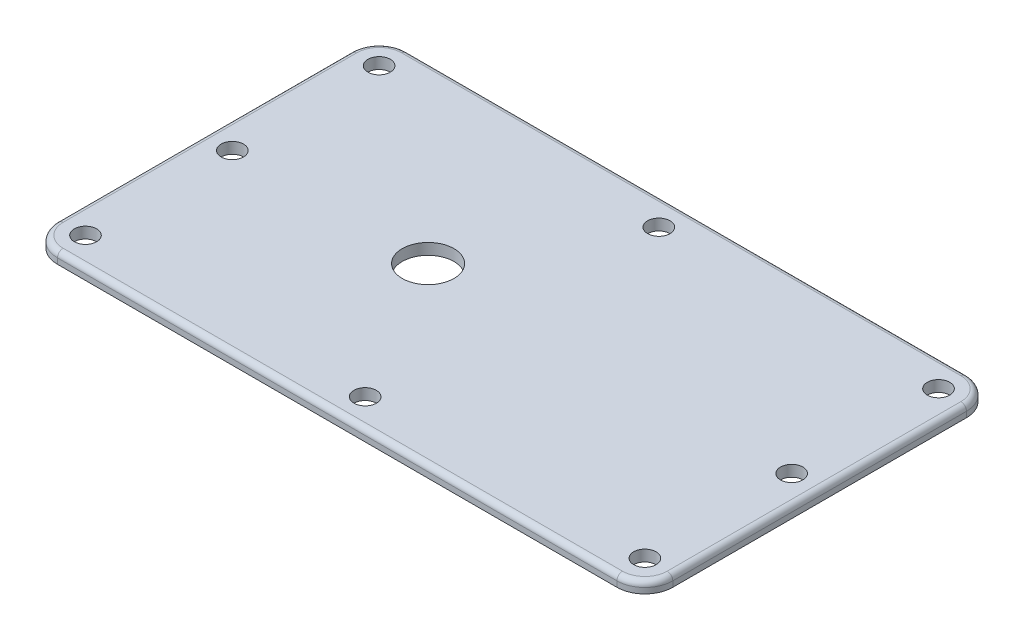
ISO-10303-21;
HEADER;
FILE_DESCRIPTION(('STEP AP214'),'2;1');
FILE_NAME('part.step','',(''),(''),'','','');
FILE_SCHEMA(('AUTOMOTIVE_DESIGN { 1 0 10303 214 1 1 1 1 }'));
ENDSEC;
DATA;
#1=APPLICATION_CONTEXT('core data for automotive mechanical design processes');
#2=APPLICATION_PROTOCOL_DEFINITION('international standard','automotive_design',2000,#1);
#3=PRODUCT_CONTEXT('',#1,'mechanical');
#4=PRODUCT('Part','Part','',(#3));
#5=PRODUCT_RELATED_PRODUCT_CATEGORY('part','',(#4));
#6=PRODUCT_DEFINITION_FORMATION('','',#4);
#7=PRODUCT_DEFINITION_CONTEXT('part definition',#1,'design');
#8=PRODUCT_DEFINITION('design','',#6,#7);
#9=PRODUCT_DEFINITION_SHAPE('','',#8);
#10=(LENGTH_UNIT() NAMED_UNIT(*) SI_UNIT(.MILLI.,.METRE.));
#11=(NAMED_UNIT(*) PLANE_ANGLE_UNIT() SI_UNIT($,.RADIAN.));
#12=(NAMED_UNIT(*) SI_UNIT($,.STERADIAN.) SOLID_ANGLE_UNIT());
#13=UNCERTAINTY_MEASURE_WITH_UNIT(LENGTH_MEASURE(1.E-05),#10,'distance_accuracy_value','');
#14=(GEOMETRIC_REPRESENTATION_CONTEXT(3) GLOBAL_UNCERTAINTY_ASSIGNED_CONTEXT((#13)) GLOBAL_UNIT_ASSIGNED_CONTEXT((#10,
#11,#12)) REPRESENTATION_CONTEXT('',''));
#15=CARTESIAN_POINT('',(0.,0.,0.));
#16=DIRECTION('',(0.,0.,1.));
#17=DIRECTION('',(1.,0.,0.));
#18=AXIS2_PLACEMENT_3D('',#15,#16,#17);
#19=CARTESIAN_POINT('',(109.428571428571,0.,-53.8392857142857));
#20=DIRECTION('',(0.,-1.,0.));
#21=DIRECTION('',(0.,0.,-1.));
#22=AXIS2_PLACEMENT_3D('',#19,#20,#21);
#23=PLANE('',#22);
#24=CARTESIAN_POINT('',(-20.5714285714286,0.,-1.33928571428573));
#25=DIRECTION('',(0.,1.,0.));
#26=DIRECTION('',(0.,0.,1.));
#27=AXIS2_PLACEMENT_3D('',#24,#25,#26);
#28=CIRCLE('',#27,9.25);
#29=CARTESIAN_POINT('',(-20.5714285714286,0.,7.91071428571427));
#30=VERTEX_POINT('',#29);
#31=EDGE_CURVE('E585',#30,#30,#28,.T.);
#32=ORIENTED_EDGE('',*,*,#31,.T.);
#33=EDGE_LOOP('',(#32));
#34=FACE_BOUND('',#33,.T.);
#35=CARTESIAN_POINT('',(-90.5714285714286,0.,-53.8392857142857));
#36=DIRECTION('',(0.,1.,0.));
#37=DIRECTION('',(0.,0.,1.));
#38=AXIS2_PLACEMENT_3D('',#35,#36,#37);
#39=CIRCLE('',#38,4.);
#40=CARTESIAN_POINT('',(-90.5714285714286,0.,-49.8392857142857));
#41=VERTEX_POINT('',#40);
#42=EDGE_CURVE('E581',#41,#41,#39,.T.);
#43=ORIENTED_EDGE('',*,*,#42,.T.);
#44=EDGE_LOOP('',(#43));
#45=FACE_BOUND('',#44,.T.);
#46=CARTESIAN_POINT('',(109.428571428571,0.,-53.8392857142857));
#47=DIRECTION('',(0.,1.,0.));
#48=DIRECTION('',(0.,0.,1.));
#49=AXIS2_PLACEMENT_3D('',#46,#47,#48);
#50=CIRCLE('',#49,4.);
#51=CARTESIAN_POINT('',(109.428571428571,0.,-49.8392857142857));
#52=VERTEX_POINT('',#51);
#53=EDGE_CURVE('E577',#52,#52,#50,.T.);
#54=ORIENTED_EDGE('',*,*,#53,.T.);
#55=EDGE_LOOP('',(#54));
#56=FACE_BOUND('',#55,.T.);
#57=CARTESIAN_POINT('',(-90.5714285714286,0.,51.1607142857143));
#58=DIRECTION('',(0.,1.,0.));
#59=DIRECTION('',(0.,0.,1.));
#60=AXIS2_PLACEMENT_3D('',#57,#58,#59);
#61=CIRCLE('',#60,4.);
#62=CARTESIAN_POINT('',(-90.5714285714286,0.,55.1607142857143));
#63=VERTEX_POINT('',#62);
#64=EDGE_CURVE('E573',#63,#63,#61,.T.);
#65=ORIENTED_EDGE('',*,*,#64,.T.);
#66=EDGE_LOOP('',(#65));
#67=FACE_BOUND('',#66,.T.);
#68=CARTESIAN_POINT('',(109.428571428571,0.,51.1607142857143));
#69=DIRECTION('',(0.,1.,0.));
#70=DIRECTION('',(0.,0.,1.));
#71=AXIS2_PLACEMENT_3D('',#68,#69,#70);
#72=CIRCLE('',#71,4.);
#73=CARTESIAN_POINT('',(109.428571428571,0.,55.1607142857143));
#74=VERTEX_POINT('',#73);
#75=EDGE_CURVE('E569',#74,#74,#72,.T.);
#76=ORIENTED_EDGE('',*,*,#75,.T.);
#77=EDGE_LOOP('',(#76));
#78=FACE_BOUND('',#77,.T.);
#79=CARTESIAN_POINT('',(109.428571428571,0.,-1.33928571428574));
#80=DIRECTION('',(0.,1.,0.));
#81=DIRECTION('',(0.,0.,1.));
#82=AXIS2_PLACEMENT_3D('',#79,#80,#81);
#83=CIRCLE('',#82,4.);
#84=CARTESIAN_POINT('',(109.428571428571,0.,2.66071428571427));
#85=VERTEX_POINT('',#84);
#86=EDGE_CURVE('E565',#85,#85,#83,.T.);
#87=ORIENTED_EDGE('',*,*,#86,.T.);
#88=EDGE_LOOP('',(#87));
#89=FACE_BOUND('',#88,.T.);
#90=CARTESIAN_POINT('',(9.42857142857137,0.,-53.8392857142857));
#91=DIRECTION('',(0.,1.,0.));
#92=DIRECTION('',(0.,0.,1.));
#93=AXIS2_PLACEMENT_3D('',#90,#91,#92);
#94=CIRCLE('',#93,4.);
#95=CARTESIAN_POINT('',(9.42857142857137,0.,-49.8392857142857));
#96=VERTEX_POINT('',#95);
#97=EDGE_CURVE('E561',#96,#96,#94,.T.);
#98=ORIENTED_EDGE('',*,*,#97,.T.);
#99=EDGE_LOOP('',(#98));
#100=FACE_BOUND('',#99,.T.);
#101=CARTESIAN_POINT('',(-90.5714285714286,0.,-1.33928571428572));
#102=DIRECTION('',(0.,1.,0.));
#103=DIRECTION('',(0.,0.,1.));
#104=AXIS2_PLACEMENT_3D('',#101,#102,#103);
#105=CIRCLE('',#104,4.);
#106=CARTESIAN_POINT('',(-90.5714285714286,0.,2.66071428571428));
#107=VERTEX_POINT('',#106);
#108=EDGE_CURVE('E555',#107,#107,#105,.T.);
#109=ORIENTED_EDGE('',*,*,#108,.T.);
#110=EDGE_LOOP('',(#109));
#111=FACE_BOUND('',#110,.T.);
#112=CARTESIAN_POINT('',(109.428571428571,0.,-53.8392857142857));
#113=DIRECTION('',(0.,1.,0.));
#114=DIRECTION('',(0.,0.,-1.));
#115=AXIS2_PLACEMENT_3D('',#112,#113,#114);
#116=CIRCLE('',#115,10.);
#117=CARTESIAN_POINT('',(119.428571428571,0.,-53.8392857142857));
#118=VERTEX_POINT('',#117);
#119=CARTESIAN_POINT('',(109.428571428571,0.,-63.8392857142857));
#120=VERTEX_POINT('',#119);
#121=EDGE_CURVE('E143',#118,#120,#116,.T.);
#122=ORIENTED_EDGE('',*,*,#121,.F.);
#123=DIRECTION('',(0.,0.,-1.));
#124=VECTOR('',#123,1.);
#125=CARTESIAN_POINT('',(119.428571428571,0.,-53.8392857142857));
#126=LINE('',#125,#124);
#127=CARTESIAN_POINT('',(119.428571428571,0.,51.1607142857142));
#128=VERTEX_POINT('',#127);
#129=EDGE_CURVE('E171',#128,#118,#126,.T.);
#130=ORIENTED_EDGE('',*,*,#129,.F.);
#131=CARTESIAN_POINT('',(109.428571428571,0.,51.1607142857143));
#132=DIRECTION('',(0.,1.,0.));
#133=DIRECTION('',(0.,0.,-1.));
#134=AXIS2_PLACEMENT_3D('',#131,#132,#133);
#135=CIRCLE('',#134,10.);
#136=CARTESIAN_POINT('',(109.428571428571,0.,61.1607142857142));
#137=VERTEX_POINT('',#136);
#138=EDGE_CURVE('E168',#137,#128,#135,.T.);
#139=ORIENTED_EDGE('',*,*,#138,.F.);
#140=DIRECTION('',(1.,0.,0.));
#141=VECTOR('',#140,1.);
#142=CARTESIAN_POINT('',(109.428571428571,0.,61.1607142857142));
#143=LINE('',#142,#141);
#144=CARTESIAN_POINT('',(-90.5714285714285,0.,61.1607142857143));
#145=VERTEX_POINT('',#144);
#146=EDGE_CURVE('E165',#145,#137,#143,.T.);
#147=ORIENTED_EDGE('',*,*,#146,.F.);
#148=CARTESIAN_POINT('',(-90.5714285714286,0.,51.1607142857143));
#149=DIRECTION('',(0.,1.,0.));
#150=DIRECTION('',(0.,0.,-1.));
#151=AXIS2_PLACEMENT_3D('',#148,#149,#150);
#152=CIRCLE('',#151,10.);
#153=CARTESIAN_POINT('',(-100.571428571429,0.,51.1607142857142));
#154=VERTEX_POINT('',#153);
#155=EDGE_CURVE('E162',#154,#145,#152,.T.);
#156=ORIENTED_EDGE('',*,*,#155,.F.);
#157=DIRECTION('',(0.,0.,1.));
#158=VECTOR('',#157,1.);
#159=CARTESIAN_POINT('',(-100.571428571429,0.,51.1607142857142));
#160=LINE('',#159,#158);
#161=CARTESIAN_POINT('',(-100.571428571429,0.,-53.8392857142857));
#162=VERTEX_POINT('',#161);
#163=EDGE_CURVE('E159',#162,#154,#160,.T.);
#164=ORIENTED_EDGE('',*,*,#163,.F.);
#165=CARTESIAN_POINT('',(-90.5714285714286,0.,-53.8392857142857));
#166=DIRECTION('',(0.,1.,0.));
#167=DIRECTION('',(0.,0.,1.));
#168=AXIS2_PLACEMENT_3D('',#165,#166,#167);
#169=CIRCLE('',#168,10.);
#170=CARTESIAN_POINT('',(-90.5714285714286,0.,-63.8392857142857));
#171=VERTEX_POINT('',#170);
#172=EDGE_CURVE('E146',#171,#162,#169,.T.);
#173=ORIENTED_EDGE('',*,*,#172,.F.);
#174=DIRECTION('',(-1.,0.,0.));
#175=VECTOR('',#174,1.);
#176=CARTESIAN_POINT('',(-90.5714285714286,0.,-63.8392857142857));
#177=LINE('',#176,#175);
#178=EDGE_CURVE('E129',#120,#171,#177,.T.);
#179=ORIENTED_EDGE('',*,*,#178,.F.);
#180=EDGE_LOOP('',(#122,#130,#139,#147,#156,#164,#173,#179));
#181=FACE_BOUND('',#180,.T.);
#182=CARTESIAN_POINT('',(9.42857142857137,0.,51.1607142857143));
#183=DIRECTION('',(0.,1.,0.));
#184=DIRECTION('',(0.,0.,1.));
#185=AXIS2_PLACEMENT_3D('',#182,#183,#184);
#186=CIRCLE('',#185,4.);
#187=CARTESIAN_POINT('',(9.42857142857137,0.,55.1607142857143));
#188=VERTEX_POINT('',#187);
#189=EDGE_CURVE('E155',#188,#188,#186,.T.);
#190=ORIENTED_EDGE('',*,*,#189,.T.);
#191=EDGE_LOOP('',(#190));
#192=FACE_BOUND('',#191,.T.);
#193=ADVANCED_FACE('F35',(#34,#45,#56,#67,#78,#89,#100,#111,#181,#192),#23,.T.);
#194=CARTESIAN_POINT('',(109.428571428571,4.,-53.8392857142857));
#195=DIRECTION('',(0.,-1.,0.));
#196=DIRECTION('',(0.,0.,-1.));
#197=AXIS2_PLACEMENT_3D('',#194,#195,#196);
#198=CYLINDRICAL_SURFACE('',#197,10.);
#199=DIRECTION('',(0.,-1.,0.));
#200=VECTOR('',#199,1.);
#201=CARTESIAN_POINT('',(109.428571428571,4.,-63.8392857142857));
#202=LINE('',#201,#200);
#203=CARTESIAN_POINT('',(109.428571428571,2.,-63.8392857142857));
#204=VERTEX_POINT('',#203);
#205=EDGE_CURVE('E125',#204,#120,#202,.T.);
#206=ORIENTED_EDGE('',*,*,#205,.F.);
#207=CARTESIAN_POINT('',(109.428571428571,2.,-53.8392857142857));
#208=DIRECTION('',(0.,-1.,0.));
#209=DIRECTION('',(0.,0.,-1.));
#210=AXIS2_PLACEMENT_3D('',#207,#208,#209);
#211=CIRCLE('',#210,10.);
#212=CARTESIAN_POINT('',(119.428571428571,2.,-53.8392857142857));
#213=VERTEX_POINT('',#212);
#214=EDGE_CURVE('E209',#204,#213,#211,.T.);
#215=ORIENTED_EDGE('',*,*,#214,.T.);
#216=DIRECTION('',(0.,-1.,0.));
#217=VECTOR('',#216,1.);
#218=CARTESIAN_POINT('',(119.428571428571,4.,-53.8392857142857));
#219=LINE('',#218,#217);
#220=EDGE_CURVE('E149',#213,#118,#219,.T.);
#221=ORIENTED_EDGE('',*,*,#220,.T.);
#222=ORIENTED_EDGE('',*,*,#121,.T.);
#223=EDGE_LOOP('',(#206,#215,#221,#222));
#224=FACE_BOUND('',#223,.T.);
#225=ADVANCED_FACE('F148',(#224),#198,.T.);
#226=CARTESIAN_POINT('',(-90.5714285714286,4.,-63.8392857142857));
#227=DIRECTION('',(0.,0.,1.));
#228=DIRECTION('',(1.,0.,0.));
#229=AXIS2_PLACEMENT_3D('',#226,#227,#228);
#230=PLANE('',#229);
#231=DIRECTION('',(0.,-1.,0.));
#232=VECTOR('',#231,1.);
#233=CARTESIAN_POINT('',(-90.5714285714286,4.,-63.8392857142857));
#234=LINE('',#233,#232);
#235=CARTESIAN_POINT('',(-90.5714285714286,2.,-63.8392857142857));
#236=VERTEX_POINT('',#235);
#237=EDGE_CURVE('E137',#236,#171,#234,.T.);
#238=ORIENTED_EDGE('',*,*,#237,.F.);
#239=DIRECTION('',(-1.,0.,0.));
#240=VECTOR('',#239,1.);
#241=CARTESIAN_POINT('',(-90.5714285714286,2.,-63.8392857142857));
#242=LINE('',#241,#240);
#243=EDGE_CURVE('E132',#236,#204,#242,.F.);
#244=ORIENTED_EDGE('',*,*,#243,.T.);
#245=ORIENTED_EDGE('',*,*,#205,.T.);
#246=ORIENTED_EDGE('',*,*,#178,.T.);
#247=EDGE_LOOP('',(#238,#244,#245,#246));
#248=FACE_BOUND('',#247,.T.);
#249=ADVANCED_FACE('F128',(#248),#230,.F.);
#250=CARTESIAN_POINT('',(-90.5714285714286,4.,-53.8392857142857));
#251=DIRECTION('',(0.,-1.,0.));
#252=DIRECTION('',(0.,0.,-1.));
#253=AXIS2_PLACEMENT_3D('',#250,#251,#252);
#254=CYLINDRICAL_SURFACE('',#253,10.);
#255=DIRECTION('',(0.,-1.,0.));
#256=VECTOR('',#255,1.);
#257=CARTESIAN_POINT('',(-100.571428571429,4.,-53.8392857142857));
#258=LINE('',#257,#256);
#259=CARTESIAN_POINT('',(-100.571428571429,2.,-53.8392857142857));
#260=VERTEX_POINT('',#259);
#261=EDGE_CURVE('E182',#260,#162,#258,.T.);
#262=ORIENTED_EDGE('',*,*,#261,.F.);
#263=CARTESIAN_POINT('',(-90.5714285714286,2.,-53.8392857142857));
#264=DIRECTION('',(0.,-1.,0.));
#265=DIRECTION('',(0.,0.,-1.));
#266=AXIS2_PLACEMENT_3D('',#263,#264,#265);
#267=CIRCLE('',#266,10.);
#268=EDGE_CURVE('E206',#260,#236,#267,.T.);
#269=ORIENTED_EDGE('',*,*,#268,.T.);
#270=ORIENTED_EDGE('',*,*,#237,.T.);
#271=ORIENTED_EDGE('',*,*,#172,.T.);
#272=EDGE_LOOP('',(#262,#269,#270,#271));
#273=FACE_BOUND('',#272,.T.);
#274=ADVANCED_FACE('F273',(#273),#254,.T.);
#275=CARTESIAN_POINT('',(-100.571428571429,4.,51.1607142857142));
#276=DIRECTION('',(1.,0.,0.));
#277=DIRECTION('',(0.,0.,-1.));
#278=AXIS2_PLACEMENT_3D('',#275,#276,#277);
#279=PLANE('',#278);
#280=DIRECTION('',(0.,-1.,0.));
#281=VECTOR('',#280,1.);
#282=CARTESIAN_POINT('',(-100.571428571429,4.,51.1607142857142));
#283=LINE('',#282,#281);
#284=CARTESIAN_POINT('',(-100.571428571429,2.,51.1607142857142));
#285=VERTEX_POINT('',#284);
#286=EDGE_CURVE('E180',#285,#154,#283,.T.);
#287=ORIENTED_EDGE('',*,*,#286,.F.);
#288=DIRECTION('',(0.,0.,1.));
#289=VECTOR('',#288,1.);
#290=CARTESIAN_POINT('',(-100.571428571429,2.,51.1607142857142));
#291=LINE('',#290,#289);
#292=EDGE_CURVE('E204',#285,#260,#291,.F.);
#293=ORIENTED_EDGE('',*,*,#292,.T.);
#294=ORIENTED_EDGE('',*,*,#261,.T.);
#295=ORIENTED_EDGE('',*,*,#163,.T.);
#296=EDGE_LOOP('',(#287,#293,#294,#295));
#297=FACE_BOUND('',#296,.T.);
#298=ADVANCED_FACE('F270',(#297),#279,.F.);
#299=CARTESIAN_POINT('',(-90.5714285714286,4.,51.1607142857143));
#300=DIRECTION('',(0.,-1.,0.));
#301=DIRECTION('',(0.,0.,-1.));
#302=AXIS2_PLACEMENT_3D('',#299,#300,#301);
#303=CYLINDRICAL_SURFACE('',#302,10.);
#304=DIRECTION('',(0.,-1.,0.));
#305=VECTOR('',#304,1.);
#306=CARTESIAN_POINT('',(-90.5714285714285,4.,61.1607142857143));
#307=LINE('',#306,#305);
#308=CARTESIAN_POINT('',(-90.5714285714285,2.,61.1607142857143));
#309=VERTEX_POINT('',#308);
#310=EDGE_CURVE('E178',#309,#145,#307,.T.);
#311=ORIENTED_EDGE('',*,*,#310,.F.);
#312=CARTESIAN_POINT('',(-90.5714285714286,2.,51.1607142857143));
#313=DIRECTION('',(0.,-1.,0.));
#314=DIRECTION('',(0.,0.,-1.));
#315=AXIS2_PLACEMENT_3D('',#312,#313,#314);
#316=CIRCLE('',#315,10.);
#317=EDGE_CURVE('E201',#309,#285,#316,.T.);
#318=ORIENTED_EDGE('',*,*,#317,.T.);
#319=ORIENTED_EDGE('',*,*,#286,.T.);
#320=ORIENTED_EDGE('',*,*,#155,.T.);
#321=EDGE_LOOP('',(#311,#318,#319,#320));
#322=FACE_BOUND('',#321,.T.);
#323=ADVANCED_FACE('F255',(#322),#303,.T.);
#324=CARTESIAN_POINT('',(109.428571428571,4.,61.1607142857142));
#325=DIRECTION('',(0.,0.,-1.));
#326=DIRECTION('',(-1.,0.,0.));
#327=AXIS2_PLACEMENT_3D('',#324,#325,#326);
#328=PLANE('',#327);
#329=DIRECTION('',(0.,-1.,0.));
#330=VECTOR('',#329,1.);
#331=CARTESIAN_POINT('',(109.428571428571,4.,61.1607142857142));
#332=LINE('',#331,#330);
#333=CARTESIAN_POINT('',(109.428571428571,2.,61.1607142857142));
#334=VERTEX_POINT('',#333);
#335=EDGE_CURVE('E176',#334,#137,#332,.T.);
#336=ORIENTED_EDGE('',*,*,#335,.F.);
#337=DIRECTION('',(1.,0.,0.));
#338=VECTOR('',#337,1.);
#339=CARTESIAN_POINT('',(109.428571428571,2.,61.1607142857142));
#340=LINE('',#339,#338);
#341=EDGE_CURVE('E11',#334,#309,#340,.F.);
#342=ORIENTED_EDGE('',*,*,#341,.T.);
#343=ORIENTED_EDGE('',*,*,#310,.T.);
#344=ORIENTED_EDGE('',*,*,#146,.T.);
#345=EDGE_LOOP('',(#336,#342,#343,#344));
#346=FACE_BOUND('',#345,.T.);
#347=ADVANCED_FACE('F252',(#346),#328,.F.);
#348=CARTESIAN_POINT('',(109.428571428571,4.,51.1607142857143));
#349=DIRECTION('',(0.,-1.,0.));
#350=DIRECTION('',(0.,0.,-1.));
#351=AXIS2_PLACEMENT_3D('',#348,#349,#350);
#352=CYLINDRICAL_SURFACE('',#351,10.);
#353=DIRECTION('',(0.,-1.,0.));
#354=VECTOR('',#353,1.);
#355=CARTESIAN_POINT('',(119.428571428571,4.,51.1607142857142));
#356=LINE('',#355,#354);
#357=CARTESIAN_POINT('',(119.428571428571,2.,51.1607142857142));
#358=VERTEX_POINT('',#357);
#359=EDGE_CURVE('E174',#358,#128,#356,.T.);
#360=ORIENTED_EDGE('',*,*,#359,.F.);
#361=CARTESIAN_POINT('',(109.428571428571,2.,51.1607142857143));
#362=DIRECTION('',(0.,-1.,0.));
#363=DIRECTION('',(0.,0.,-1.));
#364=AXIS2_PLACEMENT_3D('',#361,#362,#363);
#365=CIRCLE('',#364,10.);
#366=EDGE_CURVE('E44',#358,#334,#365,.T.);
#367=ORIENTED_EDGE('',*,*,#366,.T.);
#368=ORIENTED_EDGE('',*,*,#335,.T.);
#369=ORIENTED_EDGE('',*,*,#138,.T.);
#370=EDGE_LOOP('',(#360,#367,#368,#369));
#371=FACE_BOUND('',#370,.T.);
#372=ADVANCED_FACE('F300',(#371),#352,.T.);
#373=CARTESIAN_POINT('',(119.428571428571,4.,-53.8392857142857));
#374=DIRECTION('',(-1.,0.,0.));
#375=DIRECTION('',(0.,0.,1.));
#376=AXIS2_PLACEMENT_3D('',#373,#374,#375);
#377=PLANE('',#376);
#378=ORIENTED_EDGE('',*,*,#220,.F.);
#379=DIRECTION('',(0.,0.,-1.));
#380=VECTOR('',#379,1.);
#381=CARTESIAN_POINT('',(119.428571428571,2.,-53.8392857142857));
#382=LINE('',#381,#380);
#383=EDGE_CURVE('E59',#213,#358,#382,.F.);
#384=ORIENTED_EDGE('',*,*,#383,.T.);
#385=ORIENTED_EDGE('',*,*,#359,.T.);
#386=ORIENTED_EDGE('',*,*,#129,.T.);
#387=EDGE_LOOP('',(#378,#384,#385,#386));
#388=FACE_BOUND('',#387,.T.);
#389=ADVANCED_FACE('F297',(#388),#377,.F.);
#390=CARTESIAN_POINT('',(109.428571428571,4.,-53.8392857142857));
#391=DIRECTION('',(0.,-1.,0.));
#392=DIRECTION('',(0.,0.,-1.));
#393=AXIS2_PLACEMENT_3D('',#390,#391,#392);
#394=PLANE('',#393);
#395=CARTESIAN_POINT('',(-20.5714285714286,4.,-1.33928571428573));
#396=DIRECTION('',(0.,1.,0.));
#397=DIRECTION('',(0.,0.,1.));
#398=AXIS2_PLACEMENT_3D('',#395,#396,#397);
#399=CIRCLE('',#398,9.25);
#400=CARTESIAN_POINT('',(-20.5714285714286,4.,7.91071428571427));
#401=VERTEX_POINT('',#400);
#402=EDGE_CURVE('E522',#401,#401,#399,.T.);
#403=ORIENTED_EDGE('',*,*,#402,.F.);
#404=EDGE_LOOP('',(#403));
#405=FACE_BOUND('',#404,.T.);
#406=CARTESIAN_POINT('',(-90.5714285714286,4.,-53.8392857142857));
#407=DIRECTION('',(0.,1.,0.));
#408=DIRECTION('',(0.,0.,1.));
#409=AXIS2_PLACEMENT_3D('',#406,#407,#408);
#410=CIRCLE('',#409,4.);
#411=CARTESIAN_POINT('',(-90.5714285714286,4.,-49.8392857142857));
#412=VERTEX_POINT('',#411);
#413=EDGE_CURVE('E526',#412,#412,#410,.T.);
#414=ORIENTED_EDGE('',*,*,#413,.F.);
#415=EDGE_LOOP('',(#414));
#416=FACE_BOUND('',#415,.T.);
#417=CARTESIAN_POINT('',(109.428571428571,4.,-53.8392857142857));
#418=DIRECTION('',(0.,1.,0.));
#419=DIRECTION('',(0.,0.,1.));
#420=AXIS2_PLACEMENT_3D('',#417,#418,#419);
#421=CIRCLE('',#420,4.);
#422=CARTESIAN_POINT('',(109.428571428571,4.,-49.8392857142857));
#423=VERTEX_POINT('',#422);
#424=EDGE_CURVE('E530',#423,#423,#421,.T.);
#425=ORIENTED_EDGE('',*,*,#424,.F.);
#426=EDGE_LOOP('',(#425));
#427=FACE_BOUND('',#426,.T.);
#428=CARTESIAN_POINT('',(-90.5714285714286,4.,51.1607142857143));
#429=DIRECTION('',(0.,1.,0.));
#430=DIRECTION('',(0.,0.,1.));
#431=AXIS2_PLACEMENT_3D('',#428,#429,#430);
#432=CIRCLE('',#431,4.);
#433=CARTESIAN_POINT('',(-90.5714285714286,4.,55.1607142857143));
#434=VERTEX_POINT('',#433);
#435=EDGE_CURVE('E534',#434,#434,#432,.T.);
#436=ORIENTED_EDGE('',*,*,#435,.F.);
#437=EDGE_LOOP('',(#436));
#438=FACE_BOUND('',#437,.T.);
#439=CARTESIAN_POINT('',(109.428571428571,4.,51.1607142857143));
#440=DIRECTION('',(0.,1.,0.));
#441=DIRECTION('',(0.,0.,1.));
#442=AXIS2_PLACEMENT_3D('',#439,#440,#441);
#443=CIRCLE('',#442,4.);
#444=CARTESIAN_POINT('',(109.428571428571,4.,55.1607142857143));
#445=VERTEX_POINT('',#444);
#446=EDGE_CURVE('E538',#445,#445,#443,.T.);
#447=ORIENTED_EDGE('',*,*,#446,.F.);
#448=EDGE_LOOP('',(#447));
#449=FACE_BOUND('',#448,.T.);
#450=CARTESIAN_POINT('',(109.428571428571,4.,-1.33928571428574));
#451=DIRECTION('',(0.,1.,0.));
#452=DIRECTION('',(0.,0.,1.));
#453=AXIS2_PLACEMENT_3D('',#450,#451,#452);
#454=CIRCLE('',#453,4.);
#455=CARTESIAN_POINT('',(109.428571428571,4.,2.66071428571427));
#456=VERTEX_POINT('',#455);
#457=EDGE_CURVE('E542',#456,#456,#454,.T.);
#458=ORIENTED_EDGE('',*,*,#457,.F.);
#459=EDGE_LOOP('',(#458));
#460=FACE_BOUND('',#459,.T.);
#461=CARTESIAN_POINT('',(9.42857142857137,4.,-53.8392857142857));
#462=DIRECTION('',(0.,1.,0.));
#463=DIRECTION('',(0.,0.,1.));
#464=AXIS2_PLACEMENT_3D('',#461,#462,#463);
#465=CIRCLE('',#464,4.);
#466=CARTESIAN_POINT('',(9.42857142857137,4.,-49.8392857142857));
#467=VERTEX_POINT('',#466);
#468=EDGE_CURVE('E546',#467,#467,#465,.T.);
#469=ORIENTED_EDGE('',*,*,#468,.F.);
#470=EDGE_LOOP('',(#469));
#471=FACE_BOUND('',#470,.T.);
#472=CARTESIAN_POINT('',(-90.5714285714286,4.,-1.33928571428572));
#473=DIRECTION('',(0.,1.,0.));
#474=DIRECTION('',(0.,0.,1.));
#475=AXIS2_PLACEMENT_3D('',#472,#473,#474);
#476=CIRCLE('',#475,4.);
#477=CARTESIAN_POINT('',(-90.5714285714286,4.,2.66071428571428));
#478=VERTEX_POINT('',#477);
#479=EDGE_CURVE('E550',#478,#478,#476,.T.);
#480=ORIENTED_EDGE('',*,*,#479,.F.);
#481=EDGE_LOOP('',(#480));
#482=FACE_BOUND('',#481,.T.);
#483=CARTESIAN_POINT('',(9.42857142857137,4.,51.1607142857143));
#484=DIRECTION('',(0.,1.,0.));
#485=DIRECTION('',(0.,0.,1.));
#486=AXIS2_PLACEMENT_3D('',#483,#484,#485);
#487=CIRCLE('',#486,4.);
#488=CARTESIAN_POINT('',(9.42857142857137,4.,55.1607142857143));
#489=VERTEX_POINT('',#488);
#490=EDGE_CURVE('E553',#489,#489,#487,.T.);
#491=ORIENTED_EDGE('',*,*,#490,.F.);
#492=EDGE_LOOP('',(#491));
#493=FACE_BOUND('',#492,.T.);
#494=DIRECTION('',(0.,0.,1.));
#495=VECTOR('',#494,1.);
#496=CARTESIAN_POINT('',(-98.5714285714287,4.,-53.8392857142857));
#497=LINE('',#496,#495);
#498=CARTESIAN_POINT('',(-98.5714285714286,4.,-53.8392857142857));
#499=VERTEX_POINT('',#498);
#500=CARTESIAN_POINT('',(-98.5714285714286,4.,51.1607142857142));
#501=VERTEX_POINT('',#500);
#502=EDGE_CURVE('E196',#499,#501,#497,.T.);
#503=ORIENTED_EDGE('',*,*,#502,.T.);
#504=CARTESIAN_POINT('',(-90.5714285714286,4.,51.1607142857143));
#505=DIRECTION('',(0.,-1.,0.));
#506=DIRECTION('',(0.,0.,-1.));
#507=AXIS2_PLACEMENT_3D('',#504,#505,#506);
#508=CIRCLE('',#507,8.);
#509=CARTESIAN_POINT('',(-90.5714285714285,4.,59.1607142857143));
#510=VERTEX_POINT('',#509);
#511=EDGE_CURVE('E198',#501,#510,#508,.F.);
#512=ORIENTED_EDGE('',*,*,#511,.T.);
#513=DIRECTION('',(1.,0.,0.));
#514=VECTOR('',#513,1.);
#515=CARTESIAN_POINT('',(109.428571428571,4.,59.1607142857143));
#516=LINE('',#515,#514);
#517=CARTESIAN_POINT('',(109.428571428571,4.,59.1607142857143));
#518=VERTEX_POINT('',#517);
#519=EDGE_CURVE('E136',#510,#518,#516,.T.);
#520=ORIENTED_EDGE('',*,*,#519,.T.);
#521=CARTESIAN_POINT('',(109.428571428571,4.,51.1607142857143));
#522=DIRECTION('',(0.,-1.,0.));
#523=DIRECTION('',(0.,0.,-1.));
#524=AXIS2_PLACEMENT_3D('',#521,#522,#523);
#525=CIRCLE('',#524,8.);
#526=CARTESIAN_POINT('',(117.428571428571,4.,51.1607142857142));
#527=VERTEX_POINT('',#526);
#528=EDGE_CURVE('E186',#518,#527,#525,.F.);
#529=ORIENTED_EDGE('',*,*,#528,.T.);
#530=DIRECTION('',(0.,0.,-1.));
#531=VECTOR('',#530,1.);
#532=CARTESIAN_POINT('',(117.428571428571,4.,-53.8392857142857));
#533=LINE('',#532,#531);
#534=CARTESIAN_POINT('',(117.428571428571,4.,-53.8392857142857));
#535=VERTEX_POINT('',#534);
#536=EDGE_CURVE('E188',#527,#535,#533,.T.);
#537=ORIENTED_EDGE('',*,*,#536,.T.);
#538=CARTESIAN_POINT('',(109.428571428571,4.,-53.8392857142857));
#539=DIRECTION('',(0.,-1.,0.));
#540=DIRECTION('',(0.,0.,-1.));
#541=AXIS2_PLACEMENT_3D('',#538,#539,#540);
#542=CIRCLE('',#541,8.);
#543=CARTESIAN_POINT('',(109.428571428571,4.,-61.8392857142857));
#544=VERTEX_POINT('',#543);
#545=EDGE_CURVE('E190',#535,#544,#542,.F.);
#546=ORIENTED_EDGE('',*,*,#545,.T.);
#547=DIRECTION('',(-1.,0.,0.));
#548=VECTOR('',#547,1.);
#549=CARTESIAN_POINT('',(109.428571428571,4.,-61.8392857142857));
#550=LINE('',#549,#548);
#551=CARTESIAN_POINT('',(-90.5714285714286,4.,-61.8392857142857));
#552=VERTEX_POINT('',#551);
#553=EDGE_CURVE('E192',#544,#552,#550,.T.);
#554=ORIENTED_EDGE('',*,*,#553,.T.);
#555=CARTESIAN_POINT('',(-90.5714285714286,4.,-53.8392857142857));
#556=DIRECTION('',(0.,-1.,0.));
#557=DIRECTION('',(0.,0.,-1.));
#558=AXIS2_PLACEMENT_3D('',#555,#556,#557);
#559=CIRCLE('',#558,8.00000000000001);
#560=EDGE_CURVE('E194',#552,#499,#559,.F.);
#561=ORIENTED_EDGE('',*,*,#560,.T.);
#562=EDGE_LOOP('',(#503,#512,#520,#529,#537,#546,#554,#561));
#563=FACE_BOUND('',#562,.T.);
#564=ADVANCED_FACE('F239',(#405,#416,#427,#438,#449,#460,#471,#482,#493,#563),#394,.F.);
#565=CARTESIAN_POINT('',(109.428571428571,2.,-53.8392857142857));
#566=DIRECTION('',(0.,-1.,0.));
#567=DIRECTION('',(0.,0.,-1.));
#568=AXIS2_PLACEMENT_3D('',#565,#566,#567);
#569=TOROIDAL_SURFACE('',#568,8.,2.);
#570=CARTESIAN_POINT('',(117.428571428571,2.,-53.8392857142857));
#571=DIRECTION('',(0.,0.,1.));
#572=DIRECTION('',(1.,0.,0.));
#573=AXIS2_PLACEMENT_3D('',#570,#571,#572);
#574=CIRCLE('',#573,2.);
#575=EDGE_CURVE('E153',#213,#535,#574,.T.);
#576=ORIENTED_EDGE('',*,*,#575,.F.);
#577=ORIENTED_EDGE('',*,*,#214,.F.);
#578=CARTESIAN_POINT('',(109.428571428571,2.,-61.8392857142857));
#579=DIRECTION('',(-1.,0.,0.));
#580=DIRECTION('',(0.,0.,1.));
#581=AXIS2_PLACEMENT_3D('',#578,#579,#580);
#582=CIRCLE('',#581,2.);
#583=EDGE_CURVE('E39',#544,#204,#582,.T.);
#584=ORIENTED_EDGE('',*,*,#583,.F.);
#585=ORIENTED_EDGE('',*,*,#545,.F.);
#586=EDGE_LOOP('',(#576,#577,#584,#585));
#587=FACE_BOUND('',#586,.T.);
#588=ADVANCED_FACE('F37',(#587),#569,.T.);
#589=CARTESIAN_POINT('',(109.428571428571,2.,-61.8392857142857));
#590=DIRECTION('',(-1.,0.,0.));
#591=DIRECTION('',(0.,0.,1.));
#592=AXIS2_PLACEMENT_3D('',#589,#590,#591);
#593=CYLINDRICAL_SURFACE('',#592,2.);
#594=ORIENTED_EDGE('',*,*,#583,.T.);
#595=ORIENTED_EDGE('',*,*,#243,.F.);
#596=CARTESIAN_POINT('',(-90.5714285714286,2.,-61.8392857142857));
#597=DIRECTION('',(-1.,0.,0.));
#598=DIRECTION('',(0.,0.,1.));
#599=AXIS2_PLACEMENT_3D('',#596,#597,#598);
#600=CIRCLE('',#599,2.);
#601=EDGE_CURVE('E226',#552,#236,#600,.T.);
#602=ORIENTED_EDGE('',*,*,#601,.F.);
#603=ORIENTED_EDGE('',*,*,#553,.F.);
#604=EDGE_LOOP('',(#594,#595,#602,#603));
#605=FACE_BOUND('',#604,.T.);
#606=ADVANCED_FACE('F278',(#605),#593,.T.);
#607=CARTESIAN_POINT('',(117.428571428571,2.,-53.8392857142857));
#608=DIRECTION('',(0.,0.,-1.));
#609=DIRECTION('',(-1.,0.,0.));
#610=AXIS2_PLACEMENT_3D('',#607,#608,#609);
#611=CYLINDRICAL_SURFACE('',#610,2.);
#612=ORIENTED_EDGE('',*,*,#575,.T.);
#613=ORIENTED_EDGE('',*,*,#536,.F.);
#614=CARTESIAN_POINT('',(117.428571428571,2.,51.1607142857142));
#615=DIRECTION('',(0.,0.,1.));
#616=DIRECTION('',(1.,0.,0.));
#617=AXIS2_PLACEMENT_3D('',#614,#615,#616);
#618=CIRCLE('',#617,2.);
#619=EDGE_CURVE('E223',#358,#527,#618,.T.);
#620=ORIENTED_EDGE('',*,*,#619,.F.);
#621=ORIENTED_EDGE('',*,*,#383,.F.);
#622=EDGE_LOOP('',(#612,#613,#620,#621));
#623=FACE_BOUND('',#622,.T.);
#624=ADVANCED_FACE('F232',(#623),#611,.T.);
#625=CARTESIAN_POINT('',(-90.5714285714286,2.,-53.8392857142857));
#626=DIRECTION('',(0.,-1.,0.));
#627=DIRECTION('',(0.,0.,-1.));
#628=AXIS2_PLACEMENT_3D('',#625,#626,#627);
#629=TOROIDAL_SURFACE('',#628,8.00000000000001,2.);
#630=ORIENTED_EDGE('',*,*,#601,.T.);
#631=ORIENTED_EDGE('',*,*,#268,.F.);
#632=CARTESIAN_POINT('',(-98.5714285714286,2.,-53.8392857142857));
#633=DIRECTION('',(0.,0.,1.));
#634=DIRECTION('',(1.,0.,0.));
#635=AXIS2_PLACEMENT_3D('',#632,#633,#634);
#636=CIRCLE('',#635,2.);
#637=EDGE_CURVE('E220',#499,#260,#636,.T.);
#638=ORIENTED_EDGE('',*,*,#637,.F.);
#639=ORIENTED_EDGE('',*,*,#560,.F.);
#640=EDGE_LOOP('',(#630,#631,#638,#639));
#641=FACE_BOUND('',#640,.T.);
#642=ADVANCED_FACE('F275',(#641),#629,.T.);
#643=CARTESIAN_POINT('',(109.428571428571,2.,51.1607142857143));
#644=DIRECTION('',(0.,-1.,0.));
#645=DIRECTION('',(0.,0.,-1.));
#646=AXIS2_PLACEMENT_3D('',#643,#644,#645);
#647=TOROIDAL_SURFACE('',#646,8.,2.);
#648=ORIENTED_EDGE('',*,*,#619,.T.);
#649=ORIENTED_EDGE('',*,*,#528,.F.);
#650=CARTESIAN_POINT('',(109.428571428571,2.,59.1607142857143));
#651=DIRECTION('',(-1.,0.,0.));
#652=DIRECTION('',(0.,0.,1.));
#653=AXIS2_PLACEMENT_3D('',#650,#651,#652);
#654=CIRCLE('',#653,2.);
#655=EDGE_CURVE('E217',#334,#518,#654,.T.);
#656=ORIENTED_EDGE('',*,*,#655,.F.);
#657=ORIENTED_EDGE('',*,*,#366,.F.);
#658=EDGE_LOOP('',(#648,#649,#656,#657));
#659=FACE_BOUND('',#658,.T.);
#660=ADVANCED_FACE('F245',(#659),#647,.T.);
#661=CARTESIAN_POINT('',(-98.5714285714286,2.,-53.8392857142857));
#662=DIRECTION('',(0.,0.,1.));
#663=DIRECTION('',(1.,0.,0.));
#664=AXIS2_PLACEMENT_3D('',#661,#662,#663);
#665=CYLINDRICAL_SURFACE('',#664,2.);
#666=ORIENTED_EDGE('',*,*,#637,.T.);
#667=ORIENTED_EDGE('',*,*,#292,.F.);
#668=CARTESIAN_POINT('',(-98.5714285714286,2.,51.1607142857142));
#669=DIRECTION('',(0.,0.,1.));
#670=DIRECTION('',(1.,0.,0.));
#671=AXIS2_PLACEMENT_3D('',#668,#669,#670);
#672=CIRCLE('',#671,2.);
#673=EDGE_CURVE('E215',#501,#285,#672,.T.);
#674=ORIENTED_EDGE('',*,*,#673,.F.);
#675=ORIENTED_EDGE('',*,*,#502,.F.);
#676=EDGE_LOOP('',(#666,#667,#674,#675));
#677=FACE_BOUND('',#676,.T.);
#678=ADVANCED_FACE('F266',(#677),#665,.T.);
#679=CARTESIAN_POINT('',(109.428571428571,2.,59.1607142857143));
#680=DIRECTION('',(1.,0.,0.));
#681=DIRECTION('',(0.,0.,-1.));
#682=AXIS2_PLACEMENT_3D('',#679,#680,#681);
#683=CYLINDRICAL_SURFACE('',#682,2.);
#684=ORIENTED_EDGE('',*,*,#655,.T.);
#685=ORIENTED_EDGE('',*,*,#519,.F.);
#686=CARTESIAN_POINT('',(-90.5714285714285,2.,59.1607142857143));
#687=DIRECTION('',(-1.,0.,0.));
#688=DIRECTION('',(0.,-1.,0.));
#689=AXIS2_PLACEMENT_3D('',#686,#687,#688);
#690=CIRCLE('',#689,2.);
#691=EDGE_CURVE('E213',#309,#510,#690,.T.);
#692=ORIENTED_EDGE('',*,*,#691,.F.);
#693=ORIENTED_EDGE('',*,*,#341,.F.);
#694=EDGE_LOOP('',(#684,#685,#692,#693));
#695=FACE_BOUND('',#694,.T.);
#696=ADVANCED_FACE('F248',(#695),#683,.T.);
#697=CARTESIAN_POINT('',(-90.5714285714286,2.,51.1607142857143));
#698=DIRECTION('',(0.,-1.,0.));
#699=DIRECTION('',(0.,0.,-1.));
#700=AXIS2_PLACEMENT_3D('',#697,#698,#699);
#701=TOROIDAL_SURFACE('',#700,8.,2.);
#702=ORIENTED_EDGE('',*,*,#673,.T.);
#703=ORIENTED_EDGE('',*,*,#317,.F.);
#704=ORIENTED_EDGE('',*,*,#691,.T.);
#705=ORIENTED_EDGE('',*,*,#511,.F.);
#706=EDGE_LOOP('',(#702,#703,#704,#705));
#707=FACE_BOUND('',#706,.T.);
#708=ADVANCED_FACE('F260',(#707),#701,.T.);
#709=CARTESIAN_POINT('',(9.42857142857137,4.,51.1607142857143));
#710=DIRECTION('',(0.,1.,0.));
#711=DIRECTION('',(0.,0.,1.));
#712=AXIS2_PLACEMENT_3D('',#709,#710,#711);
#713=CYLINDRICAL_SURFACE('',#712,4.);
#714=ORIENTED_EDGE('',*,*,#189,.F.);
#715=EDGE_LOOP('',(#714));
#716=FACE_BOUND('',#715,.T.);
#717=ORIENTED_EDGE('',*,*,#490,.T.);
#718=EDGE_LOOP('',(#717));
#719=FACE_BOUND('',#718,.T.);
#720=ADVANCED_FACE('F315',(#716,#719),#713,.F.);
#721=CARTESIAN_POINT('',(-90.5714285714286,4.,-1.33928571428572));
#722=DIRECTION('',(0.,1.,0.));
#723=DIRECTION('',(0.,0.,1.));
#724=AXIS2_PLACEMENT_3D('',#721,#722,#723);
#725=CYLINDRICAL_SURFACE('',#724,4.);
#726=ORIENTED_EDGE('',*,*,#108,.F.);
#727=EDGE_LOOP('',(#726));
#728=FACE_BOUND('',#727,.T.);
#729=ORIENTED_EDGE('',*,*,#479,.T.);
#730=EDGE_LOOP('',(#729));
#731=FACE_BOUND('',#730,.T.);
#732=ADVANCED_FACE('F349',(#728,#731),#725,.F.);
#733=CARTESIAN_POINT('',(9.42857142857137,4.,-53.8392857142857));
#734=DIRECTION('',(0.,1.,0.));
#735=DIRECTION('',(0.,0.,1.));
#736=AXIS2_PLACEMENT_3D('',#733,#734,#735);
#737=CYLINDRICAL_SURFACE('',#736,4.);
#738=ORIENTED_EDGE('',*,*,#97,.F.);
#739=EDGE_LOOP('',(#738));
#740=FACE_BOUND('',#739,.T.);
#741=ORIENTED_EDGE('',*,*,#468,.T.);
#742=EDGE_LOOP('',(#741));
#743=FACE_BOUND('',#742,.T.);
#744=ADVANCED_FACE('F356',(#740,#743),#737,.F.);
#745=CARTESIAN_POINT('',(109.428571428571,4.,-1.33928571428574));
#746=DIRECTION('',(0.,1.,0.));
#747=DIRECTION('',(0.,0.,1.));
#748=AXIS2_PLACEMENT_3D('',#745,#746,#747);
#749=CYLINDRICAL_SURFACE('',#748,4.);
#750=ORIENTED_EDGE('',*,*,#86,.F.);
#751=EDGE_LOOP('',(#750));
#752=FACE_BOUND('',#751,.T.);
#753=ORIENTED_EDGE('',*,*,#457,.T.);
#754=EDGE_LOOP('',(#753));
#755=FACE_BOUND('',#754,.T.);
#756=ADVANCED_FACE('F364',(#752,#755),#749,.F.);
#757=CARTESIAN_POINT('',(109.428571428571,4.,51.1607142857143));
#758=DIRECTION('',(0.,1.,0.));
#759=DIRECTION('',(0.,0.,1.));
#760=AXIS2_PLACEMENT_3D('',#757,#758,#759);
#761=CYLINDRICAL_SURFACE('',#760,4.);
#762=ORIENTED_EDGE('',*,*,#75,.F.);
#763=EDGE_LOOP('',(#762));
#764=FACE_BOUND('',#763,.T.);
#765=ORIENTED_EDGE('',*,*,#446,.T.);
#766=EDGE_LOOP('',(#765));
#767=FACE_BOUND('',#766,.T.);
#768=ADVANCED_FACE('F372',(#764,#767),#761,.F.);
#769=CARTESIAN_POINT('',(-90.5714285714286,4.,51.1607142857143));
#770=DIRECTION('',(0.,1.,0.));
#771=DIRECTION('',(0.,0.,1.));
#772=AXIS2_PLACEMENT_3D('',#769,#770,#771);
#773=CYLINDRICAL_SURFACE('',#772,4.);
#774=ORIENTED_EDGE('',*,*,#64,.F.);
#775=EDGE_LOOP('',(#774));
#776=FACE_BOUND('',#775,.T.);
#777=ORIENTED_EDGE('',*,*,#435,.T.);
#778=EDGE_LOOP('',(#777));
#779=FACE_BOUND('',#778,.T.);
#780=ADVANCED_FACE('F380',(#776,#779),#773,.F.);
#781=CARTESIAN_POINT('',(109.428571428571,4.,-53.8392857142857));
#782=DIRECTION('',(0.,1.,0.));
#783=DIRECTION('',(0.,0.,1.));
#784=AXIS2_PLACEMENT_3D('',#781,#782,#783);
#785=CYLINDRICAL_SURFACE('',#784,4.);
#786=ORIENTED_EDGE('',*,*,#53,.F.);
#787=EDGE_LOOP('',(#786));
#788=FACE_BOUND('',#787,.T.);
#789=ORIENTED_EDGE('',*,*,#424,.T.);
#790=EDGE_LOOP('',(#789));
#791=FACE_BOUND('',#790,.T.);
#792=ADVANCED_FACE('F388',(#788,#791),#785,.F.);
#793=CARTESIAN_POINT('',(-90.5714285714286,4.,-53.8392857142857));
#794=DIRECTION('',(0.,1.,0.));
#795=DIRECTION('',(0.,0.,1.));
#796=AXIS2_PLACEMENT_3D('',#793,#794,#795);
#797=CYLINDRICAL_SURFACE('',#796,4.);
#798=ORIENTED_EDGE('',*,*,#42,.F.);
#799=EDGE_LOOP('',(#798));
#800=FACE_BOUND('',#799,.T.);
#801=ORIENTED_EDGE('',*,*,#413,.T.);
#802=EDGE_LOOP('',(#801));
#803=FACE_BOUND('',#802,.T.);
#804=ADVANCED_FACE('F396',(#800,#803),#797,.F.);
#805=CARTESIAN_POINT('',(-20.5714285714286,4.,-1.33928571428573));
#806=DIRECTION('',(0.,1.,0.));
#807=DIRECTION('',(0.,0.,1.));
#808=AXIS2_PLACEMENT_3D('',#805,#806,#807);
#809=CYLINDRICAL_SURFACE('',#808,9.25);
#810=ORIENTED_EDGE('',*,*,#31,.F.);
#811=EDGE_LOOP('',(#810));
#812=FACE_BOUND('',#811,.T.);
#813=ORIENTED_EDGE('',*,*,#402,.T.);
#814=EDGE_LOOP('',(#813));
#815=FACE_BOUND('',#814,.T.);
#816=ADVANCED_FACE('F404',(#812,#815),#809,.F.);
#817=CLOSED_SHELL('',(#193,#225,#249,#274,#298,#323,#347,#372,#389,#564,#588,#606,#624,#642,
#660,#678,#696,#708,#720,#732,#744,#756,#768,#780,#792,#804,#816));
#818=MANIFOLD_SOLID_BREP('B2',#817);
#819=ADVANCED_BREP_SHAPE_REPRESENTATION('',(#18,#818),#14);
#820=SHAPE_DEFINITION_REPRESENTATION(#9,#819);
ENDSEC;
END-ISO-10303-21;
